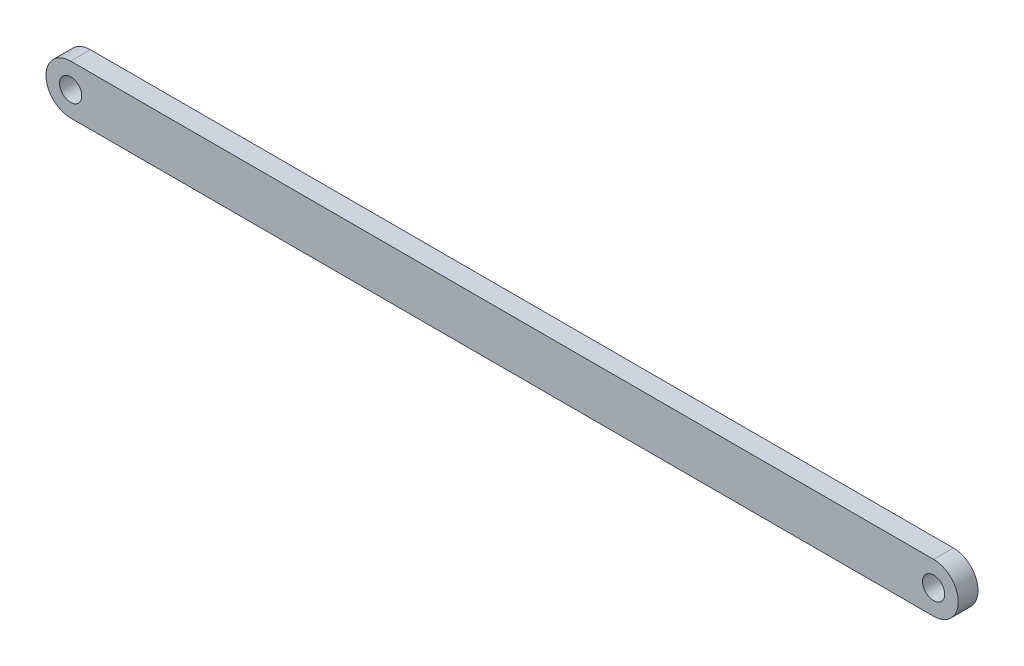
ISO-10303-21;
HEADER;
FILE_DESCRIPTION(('STEP AP214'),'2;1');
FILE_NAME('part.step','',(''),(''),'','','');
FILE_SCHEMA(('AUTOMOTIVE_DESIGN { 1 0 10303 214 1 1 1 1 }'));
ENDSEC;
DATA;
#1=APPLICATION_CONTEXT('core data for automotive mechanical design processes');
#2=APPLICATION_PROTOCOL_DEFINITION('international standard','automotive_design',2000,#1);
#3=PRODUCT_CONTEXT('',#1,'mechanical');
#4=PRODUCT('Part','Part','',(#3));
#5=PRODUCT_RELATED_PRODUCT_CATEGORY('part','',(#4));
#6=PRODUCT_DEFINITION_FORMATION('','',#4);
#7=PRODUCT_DEFINITION_CONTEXT('part definition',#1,'design');
#8=PRODUCT_DEFINITION('design','',#6,#7);
#9=PRODUCT_DEFINITION_SHAPE('','',#8);
#10=(LENGTH_UNIT() NAMED_UNIT(*) SI_UNIT(.MILLI.,.METRE.));
#11=(NAMED_UNIT(*) PLANE_ANGLE_UNIT() SI_UNIT($,.RADIAN.));
#12=(NAMED_UNIT(*) SI_UNIT($,.STERADIAN.) SOLID_ANGLE_UNIT());
#13=UNCERTAINTY_MEASURE_WITH_UNIT(LENGTH_MEASURE(1.E-05),#10,'distance_accuracy_value','');
#14=(GEOMETRIC_REPRESENTATION_CONTEXT(3) GLOBAL_UNCERTAINTY_ASSIGNED_CONTEXT((#13)) GLOBAL_UNIT_ASSIGNED_CONTEXT((#10,
#11,#12)) REPRESENTATION_CONTEXT('',''));
#15=CARTESIAN_POINT('',(0.,0.,0.));
#16=DIRECTION('',(0.,0.,1.));
#17=DIRECTION('',(1.,0.,0.));
#18=AXIS2_PLACEMENT_3D('',#15,#16,#17);
#19=CARTESIAN_POINT('',(0.,0.,2.));
#20=DIRECTION('',(0.,0.,1.));
#21=DIRECTION('',(1.,0.,0.));
#22=AXIS2_PLACEMENT_3D('',#19,#20,#21);
#23=PLANE('',#22);
#24=CARTESIAN_POINT('',(0.,0.,2.));
#25=DIRECTION('',(0.,0.,1.));
#26=DIRECTION('',(1.,0.,0.));
#27=AXIS2_PLACEMENT_3D('',#24,#25,#26);
#28=CIRCLE('',#27,2.25);
#29=CARTESIAN_POINT('',(2.25,0.,2.));
#30=VERTEX_POINT('',#29);
#31=EDGE_CURVE('E110',#30,#30,#28,.T.);
#32=ORIENTED_EDGE('',*,*,#31,.F.);
#33=EDGE_LOOP('',(#32));
#34=FACE_BOUND('',#33,.T.);
#35=CARTESIAN_POINT('',(0.,0.,2.));
#36=DIRECTION('',(0.,0.,1.));
#37=DIRECTION('',(1.,0.,0.));
#38=AXIS2_PLACEMENT_3D('',#35,#36,#37);
#39=CIRCLE('',#38,5.);
#40=CARTESIAN_POINT('',(0.,5.,2.));
#41=VERTEX_POINT('',#40);
#42=CARTESIAN_POINT('',(0.,-5.,2.));
#43=VERTEX_POINT('',#42);
#44=EDGE_CURVE('E95',#41,#43,#39,.T.);
#45=ORIENTED_EDGE('',*,*,#44,.T.);
#46=DIRECTION('',(1.,0.,0.));
#47=VECTOR('',#46,1.);
#48=CARTESIAN_POINT('',(0.,-5.,2.));
#49=LINE('',#48,#47);
#50=CARTESIAN_POINT('',(175.,-5.,2.));
#51=VERTEX_POINT('',#50);
#52=EDGE_CURVE('E90',#43,#51,#49,.T.);
#53=ORIENTED_EDGE('',*,*,#52,.T.);
#54=CARTESIAN_POINT('',(175.,0.,2.));
#55=DIRECTION('',(0.,0.,1.));
#56=DIRECTION('',(1.,0.,0.));
#57=AXIS2_PLACEMENT_3D('',#54,#55,#56);
#58=CIRCLE('',#57,5.);
#59=CARTESIAN_POINT('',(175.,5.,2.));
#60=VERTEX_POINT('',#59);
#61=EDGE_CURVE('E93',#51,#60,#58,.T.);
#62=ORIENTED_EDGE('',*,*,#61,.T.);
#63=DIRECTION('',(-1.,0.,0.));
#64=VECTOR('',#63,1.);
#65=CARTESIAN_POINT('',(0.,5.,2.));
#66=LINE('',#65,#64);
#67=EDGE_CURVE('E60',#60,#41,#66,.T.);
#68=ORIENTED_EDGE('',*,*,#67,.T.);
#69=EDGE_LOOP('',(#45,#53,#62,#68));
#70=FACE_BOUND('',#69,.T.);
#71=CARTESIAN_POINT('',(175.,0.,2.));
#72=DIRECTION('',(0.,0.,1.));
#73=DIRECTION('',(1.,0.,0.));
#74=AXIS2_PLACEMENT_3D('',#71,#72,#73);
#75=CIRCLE('',#74,2.25000000000001);
#76=CARTESIAN_POINT('',(177.25,0.,2.));
#77=VERTEX_POINT('',#76);
#78=EDGE_CURVE('E125',#77,#77,#75,.T.);
#79=ORIENTED_EDGE('',*,*,#78,.F.);
#80=EDGE_LOOP('',(#79));
#81=FACE_BOUND('',#80,.T.);
#82=ADVANCED_FACE('F43',(#34,#70,#81),#23,.T.);
#83=CARTESIAN_POINT('',(0.,0.,-2.));
#84=DIRECTION('',(0.,0.,1.));
#85=DIRECTION('',(1.,0.,0.));
#86=AXIS2_PLACEMENT_3D('',#83,#84,#85);
#87=PLANE('',#86);
#88=CARTESIAN_POINT('',(0.,0.,-2.));
#89=DIRECTION('',(0.,0.,1.));
#90=DIRECTION('',(1.,0.,0.));
#91=AXIS2_PLACEMENT_3D('',#88,#89,#90);
#92=CIRCLE('',#91,5.);
#93=CARTESIAN_POINT('',(0.,5.,-2.));
#94=VERTEX_POINT('',#93);
#95=CARTESIAN_POINT('',(0.,-5.,-2.));
#96=VERTEX_POINT('',#95);
#97=EDGE_CURVE('E107',#94,#96,#92,.T.);
#98=ORIENTED_EDGE('',*,*,#97,.F.);
#99=DIRECTION('',(-1.,0.,0.));
#100=VECTOR('',#99,1.);
#101=CARTESIAN_POINT('',(0.,5.,-2.));
#102=LINE('',#101,#100);
#103=CARTESIAN_POINT('',(175.,5.,-2.));
#104=VERTEX_POINT('',#103);
#105=EDGE_CURVE('E83',#104,#94,#102,.T.);
#106=ORIENTED_EDGE('',*,*,#105,.F.);
#107=CARTESIAN_POINT('',(175.,0.,-2.));
#108=DIRECTION('',(0.,0.,1.));
#109=DIRECTION('',(1.,0.,0.));
#110=AXIS2_PLACEMENT_3D('',#107,#108,#109);
#111=CIRCLE('',#110,5.);
#112=CARTESIAN_POINT('',(175.,-5.,-2.));
#113=VERTEX_POINT('',#112);
#114=EDGE_CURVE('E77',#113,#104,#111,.T.);
#115=ORIENTED_EDGE('',*,*,#114,.F.);
#116=DIRECTION('',(1.,0.,0.));
#117=VECTOR('',#116,1.);
#118=CARTESIAN_POINT('',(0.,-5.,-2.));
#119=LINE('',#118,#117);
#120=EDGE_CURVE('E99',#96,#113,#119,.T.);
#121=ORIENTED_EDGE('',*,*,#120,.F.);
#122=EDGE_LOOP('',(#98,#106,#115,#121));
#123=FACE_BOUND('',#122,.T.);
#124=CARTESIAN_POINT('',(0.,0.,-2.));
#125=DIRECTION('',(0.,0.,1.));
#126=DIRECTION('',(1.,0.,0.));
#127=AXIS2_PLACEMENT_3D('',#124,#125,#126);
#128=CIRCLE('',#127,2.25);
#129=CARTESIAN_POINT('',(2.25,0.,-2.));
#130=VERTEX_POINT('',#129);
#131=EDGE_CURVE('E122',#130,#130,#128,.T.);
#132=ORIENTED_EDGE('',*,*,#131,.T.);
#133=EDGE_LOOP('',(#132));
#134=FACE_BOUND('',#133,.T.);
#135=CARTESIAN_POINT('',(175.,0.,-2.));
#136=DIRECTION('',(0.,0.,1.));
#137=DIRECTION('',(1.,0.,0.));
#138=AXIS2_PLACEMENT_3D('',#135,#136,#137);
#139=CIRCLE('',#138,2.25000000000001);
#140=CARTESIAN_POINT('',(177.25,0.,-2.));
#141=VERTEX_POINT('',#140);
#142=EDGE_CURVE('E128',#141,#141,#139,.T.);
#143=ORIENTED_EDGE('',*,*,#142,.T.);
#144=EDGE_LOOP('',(#143));
#145=FACE_BOUND('',#144,.T.);
#146=ADVANCED_FACE('F118',(#123,#134,#145),#87,.F.);
#147=CARTESIAN_POINT('',(0.,0.,2.));
#148=DIRECTION('',(0.,0.,-1.));
#149=DIRECTION('',(-1.,0.,0.));
#150=AXIS2_PLACEMENT_3D('',#147,#148,#149);
#151=CYLINDRICAL_SURFACE('',#150,5.);
#152=ORIENTED_EDGE('',*,*,#97,.T.);
#153=DIRECTION('',(0.,0.,-1.));
#154=VECTOR('',#153,1.);
#155=CARTESIAN_POINT('',(0.,-5.,2.));
#156=LINE('',#155,#154);
#157=EDGE_CURVE('E11',#43,#96,#156,.T.);
#158=ORIENTED_EDGE('',*,*,#157,.F.);
#159=ORIENTED_EDGE('',*,*,#44,.F.);
#160=DIRECTION('',(0.,0.,-1.));
#161=VECTOR('',#160,1.);
#162=CARTESIAN_POINT('',(0.,5.,2.));
#163=LINE('',#162,#161);
#164=EDGE_CURVE('E103',#41,#94,#163,.T.);
#165=ORIENTED_EDGE('',*,*,#164,.T.);
#166=EDGE_LOOP('',(#152,#158,#159,#165));
#167=FACE_BOUND('',#166,.T.);
#168=ADVANCED_FACE('F45',(#167),#151,.T.);
#169=CARTESIAN_POINT('',(0.,-5.,2.));
#170=DIRECTION('',(0.,1.,0.));
#171=DIRECTION('',(0.,0.,1.));
#172=AXIS2_PLACEMENT_3D('',#169,#170,#171);
#173=PLANE('',#172);
#174=ORIENTED_EDGE('',*,*,#120,.T.);
#175=DIRECTION('',(0.,0.,-1.));
#176=VECTOR('',#175,1.);
#177=CARTESIAN_POINT('',(175.,-5.,2.));
#178=LINE('',#177,#176);
#179=EDGE_CURVE('E52',#51,#113,#178,.T.);
#180=ORIENTED_EDGE('',*,*,#179,.F.);
#181=ORIENTED_EDGE('',*,*,#52,.F.);
#182=ORIENTED_EDGE('',*,*,#157,.T.);
#183=EDGE_LOOP('',(#174,#180,#181,#182));
#184=FACE_BOUND('',#183,.T.);
#185=ADVANCED_FACE('F98',(#184),#173,.F.);
#186=CARTESIAN_POINT('',(175.,0.,2.));
#187=DIRECTION('',(0.,0.,-1.));
#188=DIRECTION('',(-1.,0.,0.));
#189=AXIS2_PLACEMENT_3D('',#186,#187,#188);
#190=CYLINDRICAL_SURFACE('',#189,5.);
#191=ORIENTED_EDGE('',*,*,#114,.T.);
#192=DIRECTION('',(0.,0.,-1.));
#193=VECTOR('',#192,1.);
#194=CARTESIAN_POINT('',(175.,5.,2.));
#195=LINE('',#194,#193);
#196=EDGE_CURVE('E100',#60,#104,#195,.T.);
#197=ORIENTED_EDGE('',*,*,#196,.F.);
#198=ORIENTED_EDGE('',*,*,#61,.F.);
#199=ORIENTED_EDGE('',*,*,#179,.T.);
#200=EDGE_LOOP('',(#191,#197,#198,#199));
#201=FACE_BOUND('',#200,.T.);
#202=ADVANCED_FACE('F101',(#201),#190,.T.);
#203=CARTESIAN_POINT('',(0.,5.,2.));
#204=DIRECTION('',(0.,-1.,0.));
#205=DIRECTION('',(0.,0.,-1.));
#206=AXIS2_PLACEMENT_3D('',#203,#204,#205);
#207=PLANE('',#206);
#208=ORIENTED_EDGE('',*,*,#105,.T.);
#209=ORIENTED_EDGE('',*,*,#164,.F.);
#210=ORIENTED_EDGE('',*,*,#67,.F.);
#211=ORIENTED_EDGE('',*,*,#196,.T.);
#212=EDGE_LOOP('',(#208,#209,#210,#211));
#213=FACE_BOUND('',#212,.T.);
#214=ADVANCED_FACE('F115',(#213),#207,.F.);
#215=CARTESIAN_POINT('',(0.,0.,2.));
#216=DIRECTION('',(0.,0.,-1.));
#217=DIRECTION('',(-1.,0.,0.));
#218=AXIS2_PLACEMENT_3D('',#215,#216,#217);
#219=CYLINDRICAL_SURFACE('',#218,2.25);
#220=ORIENTED_EDGE('',*,*,#31,.T.);
#221=EDGE_LOOP('',(#220));
#222=FACE_BOUND('',#221,.T.);
#223=ORIENTED_EDGE('',*,*,#131,.F.);
#224=EDGE_LOOP('',(#223));
#225=FACE_BOUND('',#224,.T.);
#226=ADVANCED_FACE('F145',(#222,#225),#219,.F.);
#227=CARTESIAN_POINT('',(175.,0.,2.));
#228=DIRECTION('',(0.,0.,-1.));
#229=DIRECTION('',(-1.,0.,0.));
#230=AXIS2_PLACEMENT_3D('',#227,#228,#229);
#231=CYLINDRICAL_SURFACE('',#230,2.25000000000001);
#232=ORIENTED_EDGE('',*,*,#78,.T.);
#233=EDGE_LOOP('',(#232));
#234=FACE_BOUND('',#233,.T.);
#235=ORIENTED_EDGE('',*,*,#142,.F.);
#236=EDGE_LOOP('',(#235));
#237=FACE_BOUND('',#236,.T.);
#238=ADVANCED_FACE('F134',(#234,#237),#231,.F.);
#239=CLOSED_SHELL('',(#82,#146,#168,#185,#202,#214,#226,#238));
#240=MANIFOLD_SOLID_BREP('B2',#239);
#241=ADVANCED_BREP_SHAPE_REPRESENTATION('',(#18,#240),#14);
#242=SHAPE_DEFINITION_REPRESENTATION(#9,#241);
ENDSEC;
END-ISO-10303-21;
